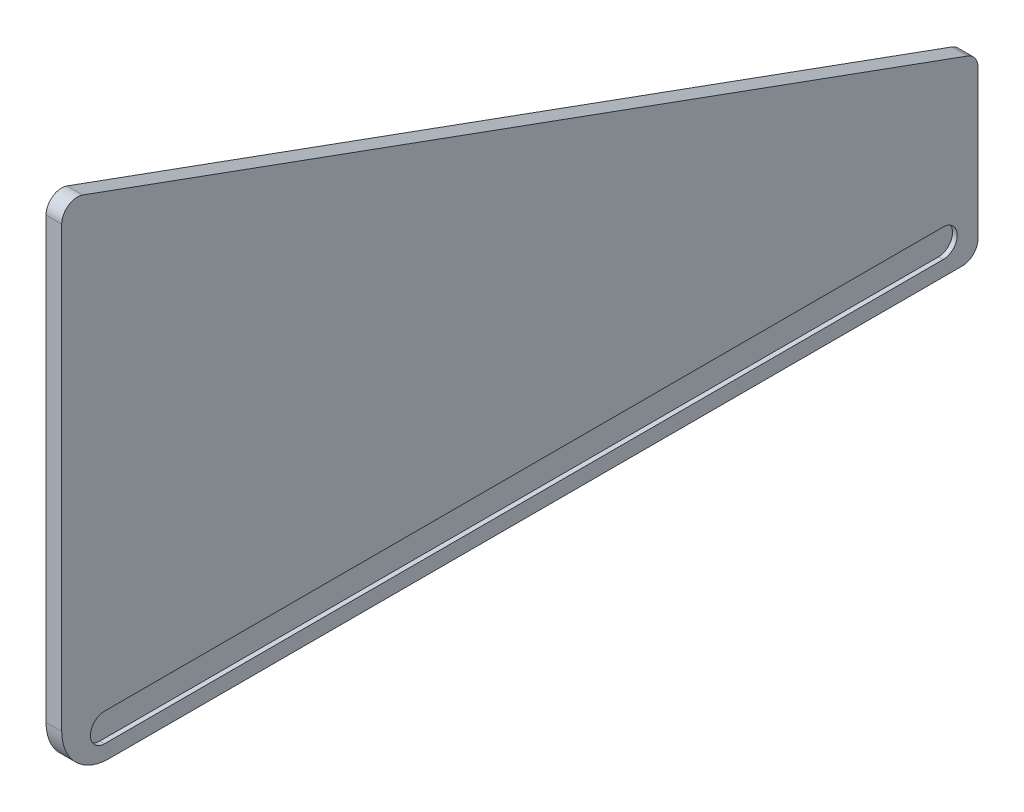
ISO-10303-21;
HEADER;
FILE_DESCRIPTION(('STEP AP214'),'2;1');
FILE_NAME('part.step','',(''),(''),'','','');
FILE_SCHEMA(('AUTOMOTIVE_DESIGN { 1 0 10303 214 1 1 1 1 }'));
ENDSEC;
DATA;
#1=APPLICATION_CONTEXT('core data for automotive mechanical design processes');
#2=APPLICATION_PROTOCOL_DEFINITION('international standard','automotive_design',2000,#1);
#3=PRODUCT_CONTEXT('',#1,'mechanical');
#4=PRODUCT('Part','Part','',(#3));
#5=PRODUCT_RELATED_PRODUCT_CATEGORY('part','',(#4));
#6=PRODUCT_DEFINITION_FORMATION('','',#4);
#7=PRODUCT_DEFINITION_CONTEXT('part definition',#1,'design');
#8=PRODUCT_DEFINITION('design','',#6,#7);
#9=PRODUCT_DEFINITION_SHAPE('','',#8);
#10=(LENGTH_UNIT() NAMED_UNIT(*) SI_UNIT(.MILLI.,.METRE.));
#11=(NAMED_UNIT(*) PLANE_ANGLE_UNIT() SI_UNIT($,.RADIAN.));
#12=(NAMED_UNIT(*) SI_UNIT($,.STERADIAN.) SOLID_ANGLE_UNIT());
#13=UNCERTAINTY_MEASURE_WITH_UNIT(LENGTH_MEASURE(1.E-05),#10,'distance_accuracy_value','');
#14=(GEOMETRIC_REPRESENTATION_CONTEXT(3) GLOBAL_UNCERTAINTY_ASSIGNED_CONTEXT((#13)) GLOBAL_UNIT_ASSIGNED_CONTEXT((#10,
#11,#12)) REPRESENTATION_CONTEXT('',''));
#15=CARTESIAN_POINT('',(0.,0.,0.));
#16=DIRECTION('',(0.,0.,1.));
#17=DIRECTION('',(1.,0.,0.));
#18=AXIS2_PLACEMENT_3D('',#15,#16,#17);
#19=CARTESIAN_POINT('',(10.,-294.281480067421,-30.));
#20=DIRECTION('',(-1.,0.,0.));
#21=DIRECTION('',(0.,0.,1.));
#22=AXIS2_PLACEMENT_3D('',#19,#20,#21);
#23=CYLINDRICAL_SURFACE('',#22,30.);
#24=CARTESIAN_POINT('',(0.,-294.281480067421,-30.));
#25=DIRECTION('',(1.,0.,0.));
#26=DIRECTION('',(0.,0.,1.));
#27=AXIS2_PLACEMENT_3D('',#24,#25,#26);
#28=CIRCLE('',#27,30.);
#29=CARTESIAN_POINT('',(0.,-294.281480067421,0.));
#30=VERTEX_POINT('',#29);
#31=CARTESIAN_POINT('',(0.,-324.281480067421,-30.));
#32=VERTEX_POINT('',#31);
#33=EDGE_CURVE('E285',#30,#32,#28,.T.);
#34=ORIENTED_EDGE('',*,*,#33,.T.);
#35=DIRECTION('',(-1.,0.,0.));
#36=VECTOR('',#35,1.);
#37=CARTESIAN_POINT('',(10.,-324.281480067421,-30.));
#38=LINE('',#37,#36);
#39=CARTESIAN_POINT('',(10.,-324.281480067421,-30.));
#40=VERTEX_POINT('',#39);
#41=EDGE_CURVE('E11',#40,#32,#38,.T.);
#42=ORIENTED_EDGE('',*,*,#41,.F.);
#43=CARTESIAN_POINT('',(10.,-294.281480067421,-30.));
#44=DIRECTION('',(1.,0.,0.));
#45=DIRECTION('',(0.,0.,1.));
#46=AXIS2_PLACEMENT_3D('',#43,#44,#45);
#47=CIRCLE('',#46,30.);
#48=CARTESIAN_POINT('',(10.,-294.281480067421,0.));
#49=VERTEX_POINT('',#48);
#50=EDGE_CURVE('E292',#49,#40,#47,.T.);
#51=ORIENTED_EDGE('',*,*,#50,.F.);
#52=DIRECTION('',(-1.,0.,0.));
#53=VECTOR('',#52,1.);
#54=CARTESIAN_POINT('',(10.,-294.281480067421,0.));
#55=LINE('',#54,#53);
#56=EDGE_CURVE('E310',#49,#30,#55,.T.);
#57=ORIENTED_EDGE('',*,*,#56,.T.);
#58=EDGE_LOOP('',(#34,#42,#51,#57));
#59=FACE_BOUND('',#58,.T.);
#60=ADVANCED_FACE('F34',(#59),#23,.T.);
#61=CARTESIAN_POINT('',(10.,-324.281480067421,-30.));
#62=DIRECTION('',(0.,1.,0.));
#63=DIRECTION('',(0.,0.,1.));
#64=AXIS2_PLACEMENT_3D('',#61,#62,#63);
#65=PLANE('',#64);
#66=DIRECTION('',(0.,0.,-1.));
#67=VECTOR('',#66,1.);
#68=CARTESIAN_POINT('',(0.,-324.281480067421,-30.));
#69=LINE('',#68,#67);
#70=CARTESIAN_POINT('',(0.,-324.281480067421,-573.815572471544));
#71=VERTEX_POINT('',#70);
#72=EDGE_CURVE('E313',#32,#71,#69,.T.);
#73=ORIENTED_EDGE('',*,*,#72,.T.);
#74=DIRECTION('',(-1.,0.,0.));
#75=VECTOR('',#74,1.);
#76=CARTESIAN_POINT('',(10.,-324.281480067421,-573.815572471544));
#77=LINE('',#76,#75);
#78=CARTESIAN_POINT('',(10.,-324.281480067421,-573.815572471544));
#79=VERTEX_POINT('',#78);
#80=EDGE_CURVE('E41',#79,#71,#77,.T.);
#81=ORIENTED_EDGE('',*,*,#80,.F.);
#82=DIRECTION('',(0.,0.,-1.));
#83=VECTOR('',#82,1.);
#84=CARTESIAN_POINT('',(10.,-324.281480067421,-30.));
#85=LINE('',#84,#83);
#86=EDGE_CURVE('E295',#40,#79,#85,.T.);
#87=ORIENTED_EDGE('',*,*,#86,.F.);
#88=ORIENTED_EDGE('',*,*,#41,.T.);
#89=EDGE_LOOP('',(#73,#81,#87,#88));
#90=FACE_BOUND('',#89,.T.);
#91=ADVANCED_FACE('F370',(#90),#65,.F.);
#92=CARTESIAN_POINT('',(10.,-314.281480067421,-573.815572471544));
#93=DIRECTION('',(-1.,0.,0.));
#94=DIRECTION('',(0.,0.,1.));
#95=AXIS2_PLACEMENT_3D('',#92,#93,#94);
#96=CYLINDRICAL_SURFACE('',#95,10.);
#97=CARTESIAN_POINT('',(0.,-314.281480067421,-573.815572471544));
#98=DIRECTION('',(1.,0.,0.));
#99=DIRECTION('',(0.,0.,-1.));
#100=AXIS2_PLACEMENT_3D('',#97,#98,#99);
#101=CIRCLE('',#100,10.);
#102=CARTESIAN_POINT('',(0.,-314.281480067421,-583.815572471544));
#103=VERTEX_POINT('',#102);
#104=EDGE_CURVE('E315',#71,#103,#101,.T.);
#105=ORIENTED_EDGE('',*,*,#104,.T.);
#106=DIRECTION('',(-1.,0.,0.));
#107=VECTOR('',#106,1.);
#108=CARTESIAN_POINT('',(10.,-314.281480067421,-583.815572471544));
#109=LINE('',#108,#107);
#110=CARTESIAN_POINT('',(10.,-314.281480067421,-583.815572471544));
#111=VERTEX_POINT('',#110);
#112=EDGE_CURVE('E340',#111,#103,#109,.T.);
#113=ORIENTED_EDGE('',*,*,#112,.F.);
#114=CARTESIAN_POINT('',(10.,-314.281480067421,-573.815572471544));
#115=DIRECTION('',(1.,0.,0.));
#116=DIRECTION('',(0.,0.,-1.));
#117=AXIS2_PLACEMENT_3D('',#114,#115,#116);
#118=CIRCLE('',#117,10.);
#119=EDGE_CURVE('E298',#79,#111,#118,.T.);
#120=ORIENTED_EDGE('',*,*,#119,.F.);
#121=ORIENTED_EDGE('',*,*,#80,.T.);
#122=EDGE_LOOP('',(#105,#113,#120,#121));
#123=FACE_BOUND('',#122,.T.);
#124=ADVANCED_FACE('F347',(#123),#96,.T.);
#125=CARTESIAN_POINT('',(10.,-314.281480067421,-583.815572471544));
#126=DIRECTION('',(0.,0.,1.));
#127=DIRECTION('',(1.,0.,0.));
#128=AXIS2_PLACEMENT_3D('',#125,#126,#127);
#129=PLANE('',#128);
#130=DIRECTION('',(0.,1.,0.));
#131=VECTOR('',#130,1.);
#132=CARTESIAN_POINT('',(0.,-314.281480067421,-583.815572471544));
#133=LINE('',#132,#131);
#134=CARTESIAN_POINT('',(0.,-219.493566062825,-583.815572471544));
#135=VERTEX_POINT('',#134);
#136=EDGE_CURVE('E317',#103,#135,#133,.T.);
#137=ORIENTED_EDGE('',*,*,#136,.T.);
#138=DIRECTION('',(-1.,0.,0.));
#139=VECTOR('',#138,1.);
#140=CARTESIAN_POINT('',(10.,-219.493566062825,-583.815572471544));
#141=LINE('',#140,#139);
#142=CARTESIAN_POINT('',(10.,-219.493566062825,-583.815572471544));
#143=VERTEX_POINT('',#142);
#144=EDGE_CURVE('E337',#143,#135,#141,.T.);
#145=ORIENTED_EDGE('',*,*,#144,.F.);
#146=DIRECTION('',(0.,1.,0.));
#147=VECTOR('',#146,1.);
#148=CARTESIAN_POINT('',(10.,-314.281480067421,-583.815572471544));
#149=LINE('',#148,#147);
#150=EDGE_CURVE('E300',#111,#143,#149,.T.);
#151=ORIENTED_EDGE('',*,*,#150,.F.);
#152=ORIENTED_EDGE('',*,*,#112,.T.);
#153=EDGE_LOOP('',(#137,#145,#151,#152));
#154=FACE_BOUND('',#153,.T.);
#155=ADVANCED_FACE('F358',(#154),#129,.F.);
#156=CARTESIAN_POINT('',(10.,-219.493566062825,-573.815572471544));
#157=DIRECTION('',(-1.,0.,0.));
#158=DIRECTION('',(0.,0.,1.));
#159=AXIS2_PLACEMENT_3D('',#156,#157,#158);
#160=CYLINDRICAL_SURFACE('',#159,10.);
#161=CARTESIAN_POINT('',(0.,-219.493566062825,-573.815572471544));
#162=DIRECTION('',(1.,0.,0.));
#163=DIRECTION('',(0.,0.,-1.));
#164=AXIS2_PLACEMENT_3D('',#161,#162,#163);
#165=CIRCLE('',#164,10.);
#166=CARTESIAN_POINT('',(0.,-210.096639854966,-577.235773904801));
#167=VERTEX_POINT('',#166);
#168=EDGE_CURVE('E319',#135,#167,#165,.T.);
#169=ORIENTED_EDGE('',*,*,#168,.T.);
#170=DIRECTION('',(-1.,0.,0.));
#171=VECTOR('',#170,1.);
#172=CARTESIAN_POINT('',(10.,-210.096639854966,-577.235773904801));
#173=LINE('',#172,#171);
#174=CARTESIAN_POINT('',(10.,-210.096639854966,-577.235773904801));
#175=VERTEX_POINT('',#174);
#176=EDGE_CURVE('E334',#175,#167,#173,.T.);
#177=ORIENTED_EDGE('',*,*,#176,.F.);
#178=CARTESIAN_POINT('',(10.,-219.493566062825,-573.815572471544));
#179=DIRECTION('',(1.,0.,0.));
#180=DIRECTION('',(0.,0.,-1.));
#181=AXIS2_PLACEMENT_3D('',#178,#179,#180);
#182=CIRCLE('',#181,10.);
#183=EDGE_CURVE('E302',#143,#175,#182,.T.);
#184=ORIENTED_EDGE('',*,*,#183,.F.);
#185=ORIENTED_EDGE('',*,*,#144,.T.);
#186=EDGE_LOOP('',(#169,#177,#184,#185));
#187=FACE_BOUND('',#186,.T.);
#188=ADVANCED_FACE('F362',(#187),#160,.T.);
#189=CARTESIAN_POINT('',(10.,-210.096639854966,-577.235773904801));
#190=DIRECTION('',(0.,-0.939692620785907,0.342020143325672));
#191=DIRECTION('',(0.,-0.342020143325672,-0.939692620785907));
#192=AXIS2_PLACEMENT_3D('',#189,#190,#191);
#193=PLANE('',#192);
#194=DIRECTION('',(0.,0.342020143325672,0.939692620785907));
#195=VECTOR('',#194,1.);
#196=CARTESIAN_POINT('',(0.,-210.096639854966,-577.235773904801));
#197=LINE('',#196,#195);
#198=CARTESIAN_POINT('',(0.,-4.88455385956217,-13.4202014332568));
#199=VERTEX_POINT('',#198);
#200=EDGE_CURVE('E321',#167,#199,#197,.T.);
#201=ORIENTED_EDGE('',*,*,#200,.T.);
#202=DIRECTION('',(-1.,0.,0.));
#203=VECTOR('',#202,1.);
#204=CARTESIAN_POINT('',(10.,-4.88455385956217,-13.4202014332568));
#205=LINE('',#204,#203);
#206=CARTESIAN_POINT('',(10.,-4.88455385956217,-13.4202014332568));
#207=VERTEX_POINT('',#206);
#208=EDGE_CURVE('E331',#207,#199,#205,.T.);
#209=ORIENTED_EDGE('',*,*,#208,.F.);
#210=DIRECTION('',(0.,0.342020143325672,0.939692620785907));
#211=VECTOR('',#210,1.);
#212=CARTESIAN_POINT('',(10.,-210.096639854966,-577.235773904801));
#213=LINE('',#212,#211);
#214=EDGE_CURVE('E304',#175,#207,#213,.T.);
#215=ORIENTED_EDGE('',*,*,#214,.F.);
#216=ORIENTED_EDGE('',*,*,#176,.T.);
#217=EDGE_LOOP('',(#201,#209,#215,#216));
#218=FACE_BOUND('',#217,.T.);
#219=ADVANCED_FACE('F383',(#218),#193,.F.);
#220=CARTESIAN_POINT('',(10.,-14.2814800674212,-10.));
#221=DIRECTION('',(-1.,0.,0.));
#222=DIRECTION('',(0.,0.,1.));
#223=AXIS2_PLACEMENT_3D('',#220,#221,#222);
#224=CYLINDRICAL_SURFACE('',#223,10.);
#225=CARTESIAN_POINT('',(0.,-14.2814800674212,-10.));
#226=DIRECTION('',(1.,0.,0.));
#227=DIRECTION('',(0.,0.,-1.));
#228=AXIS2_PLACEMENT_3D('',#225,#226,#227);
#229=CIRCLE('',#228,10.);
#230=CARTESIAN_POINT('',(0.,-14.2814800674213,0.));
#231=VERTEX_POINT('',#230);
#232=EDGE_CURVE('E323',#199,#231,#229,.T.);
#233=ORIENTED_EDGE('',*,*,#232,.T.);
#234=DIRECTION('',(-1.,0.,0.));
#235=VECTOR('',#234,1.);
#236=CARTESIAN_POINT('',(10.,-14.2814800674213,0.));
#237=LINE('',#236,#235);
#238=CARTESIAN_POINT('',(10.,-14.2814800674213,0.));
#239=VERTEX_POINT('',#238);
#240=EDGE_CURVE('E328',#239,#231,#237,.T.);
#241=ORIENTED_EDGE('',*,*,#240,.F.);
#242=CARTESIAN_POINT('',(10.,-14.2814800674212,-10.));
#243=DIRECTION('',(1.,0.,0.));
#244=DIRECTION('',(0.,0.,-1.));
#245=AXIS2_PLACEMENT_3D('',#242,#243,#244);
#246=CIRCLE('',#245,10.);
#247=EDGE_CURVE('E306',#207,#239,#246,.T.);
#248=ORIENTED_EDGE('',*,*,#247,.F.);
#249=ORIENTED_EDGE('',*,*,#208,.T.);
#250=EDGE_LOOP('',(#233,#241,#248,#249));
#251=FACE_BOUND('',#250,.T.);
#252=ADVANCED_FACE('F381',(#251),#224,.T.);
#253=CARTESIAN_POINT('',(10.,-14.2814800674213,0.));
#254=DIRECTION('',(0.,0.,-1.));
#255=DIRECTION('',(0.,1.,0.));
#256=AXIS2_PLACEMENT_3D('',#253,#254,#255);
#257=PLANE('',#256);
#258=DIRECTION('',(0.,-1.,0.));
#259=VECTOR('',#258,1.);
#260=CARTESIAN_POINT('',(0.,-14.2814800674213,0.));
#261=LINE('',#260,#259);
#262=EDGE_CURVE('E296',#231,#30,#261,.T.);
#263=ORIENTED_EDGE('',*,*,#262,.T.);
#264=ORIENTED_EDGE('',*,*,#56,.F.);
#265=DIRECTION('',(0.,-1.,0.));
#266=VECTOR('',#265,1.);
#267=CARTESIAN_POINT('',(10.,-14.2814800674213,0.));
#268=LINE('',#267,#266);
#269=EDGE_CURVE('E308',#239,#49,#268,.T.);
#270=ORIENTED_EDGE('',*,*,#269,.F.);
#271=ORIENTED_EDGE('',*,*,#240,.T.);
#272=EDGE_LOOP('',(#263,#264,#270,#271));
#273=FACE_BOUND('',#272,.T.);
#274=ADVANCED_FACE('F376',(#273),#257,.F.);
#275=CARTESIAN_POINT('',(10.,-294.281480067421,-30.));
#276=DIRECTION('',(-1.,0.,0.));
#277=DIRECTION('',(0.,0.,1.));
#278=AXIS2_PLACEMENT_3D('',#275,#276,#277);
#279=PLANE('',#278);
#280=DIRECTION('',(0.,0.,1.));
#281=VECTOR('',#280,1.);
#282=CARTESIAN_POINT('',(10.,-296.630106088856,-561.587294138042));
#283=LINE('',#282,#281);
#284=CARTESIAN_POINT('',(10.,-296.630106088856,-561.587294138042));
#285=VERTEX_POINT('',#284);
#286=CARTESIAN_POINT('',(10.,-296.630106088856,-27.2919792728029));
#287=VERTEX_POINT('',#286);
#288=EDGE_CURVE('E199',#285,#287,#283,.T.);
#289=ORIENTED_EDGE('',*,*,#288,.F.);
#290=CARTESIAN_POINT('',(10.,-305.630106088856,-561.587294138042));
#291=DIRECTION('',(1.,0.,0.));
#292=DIRECTION('',(0.,0.,-1.));
#293=AXIS2_PLACEMENT_3D('',#290,#291,#292);
#294=CIRCLE('',#293,9.00000000000001);
#295=CARTESIAN_POINT('',(10.,-314.630106088856,-561.587294138042));
#296=VERTEX_POINT('',#295);
#297=EDGE_CURVE('E48',#296,#285,#294,.T.);
#298=ORIENTED_EDGE('',*,*,#297,.F.);
#299=DIRECTION('',(0.,0.,-1.));
#300=VECTOR('',#299,1.);
#301=CARTESIAN_POINT('',(10.,-314.630106088856,-27.2919792728029));
#302=LINE('',#301,#300);
#303=CARTESIAN_POINT('',(10.,-314.630106088856,-27.2919792728029));
#304=VERTEX_POINT('',#303);
#305=EDGE_CURVE('E190',#304,#296,#302,.T.);
#306=ORIENTED_EDGE('',*,*,#305,.F.);
#307=CARTESIAN_POINT('',(10.,-305.630106088856,-27.2919792728029));
#308=DIRECTION('',(1.,0.,0.));
#309=DIRECTION('',(0.,0.,-1.));
#310=AXIS2_PLACEMENT_3D('',#307,#308,#309);
#311=CIRCLE('',#310,8.99999999999995);
#312=EDGE_CURVE('E193',#287,#304,#311,.T.);
#313=ORIENTED_EDGE('',*,*,#312,.F.);
#314=EDGE_LOOP('',(#289,#298,#306,#313));
#315=FACE_BOUND('',#314,.T.);
#316=ORIENTED_EDGE('',*,*,#50,.T.);
#317=ORIENTED_EDGE('',*,*,#86,.T.);
#318=ORIENTED_EDGE('',*,*,#119,.T.);
#319=ORIENTED_EDGE('',*,*,#150,.T.);
#320=ORIENTED_EDGE('',*,*,#183,.T.);
#321=ORIENTED_EDGE('',*,*,#214,.T.);
#322=ORIENTED_EDGE('',*,*,#247,.T.);
#323=ORIENTED_EDGE('',*,*,#269,.T.);
#324=EDGE_LOOP('',(#316,#317,#318,#319,#320,#321,#322,#323));
#325=FACE_BOUND('',#324,.T.);
#326=ADVANCED_FACE('F366',(#315,#325),#279,.F.);
#327=CARTESIAN_POINT('',(0.,-294.281480067421,-30.));
#328=DIRECTION('',(-1.,0.,0.));
#329=DIRECTION('',(0.,0.,1.));
#330=AXIS2_PLACEMENT_3D('',#327,#328,#329);
#331=PLANE('',#330);
#332=CARTESIAN_POINT('',(0.,-205.316311304833,-356.320107689534));
#333=CARTESIAN_POINT('',(0.,-205.964445920581,-352.838937222535));
#334=CARTESIAN_POINT('',(0.,-217.989087479131,-121.396454164475));
#335=CARTESIAN_POINT('',(0.,-66.6295550857602,-35.3127262433403));
#336=CARTESIAN_POINT('',(0.,-47.7372149956287,-26.9501856712703));
#337=B_SPLINE_CURVE_WITH_KNOTS('',3,(#332,#333,#334,#335,#336),.UNSPECIFIED.,.F.,.F.,(4,1,4),
(0.,0.409684669558369,1.),.UNSPECIFIED.);
#338=CARTESIAN_POINT('',(0.,-205.316311304832,-356.320107689534));
#339=VERTEX_POINT('',#338);
#340=CARTESIAN_POINT('',(0.,-47.7372149956287,-26.9501856712703));
#341=VERTEX_POINT('',#340);
#342=EDGE_CURVE('E56',#339,#341,#337,.T.);
#343=ORIENTED_EDGE('',*,*,#342,.F.);
#344=CARTESIAN_POINT('',(0.,-188.394419043439,-353.169539728973));
#345=DIRECTION('',(-1.,0.,0.));
#346=DIRECTION('',(0.,0.,1.));
#347=AXIS2_PLACEMENT_3D('',#344,#345,#346);
#348=CIRCLE('',#347,17.2126847464395);
#349=CARTESIAN_POINT('',(0.,-171.181734297002,-353.169530365349));
#350=VERTEX_POINT('',#349);
#351=EDGE_CURVE('E215',#350,#339,#348,.T.);
#352=ORIENTED_EDGE('',*,*,#351,.F.);
#353=CARTESIAN_POINT('',(0.,-39.1543533593346,-35.1249178966076));
#354=CARTESIAN_POINT('',(0.,-45.1224459351378,-50.6029528282735));
#355=CARTESIAN_POINT('',(0.,-170.661871262547,-99.0425390004754));
#356=CARTESIAN_POINT('',(0.,-171.181746235272,-331.224003862466));
#357=CARTESIAN_POINT('',(0.,-171.181734297002,-353.169530365349));
#358=B_SPLINE_CURVE_WITH_KNOTS('',3,(#353,#354,#355,#356,#357),.UNSPECIFIED.,.F.,.F.,(4,1,4),
(0.,0.639195597187541,1.),.UNSPECIFIED.);
#359=CARTESIAN_POINT('',(0.,-39.1543533593346,-35.1249178966076));
#360=VERTEX_POINT('',#359);
#361=EDGE_CURVE('E592',#360,#350,#358,.T.);
#362=ORIENTED_EDGE('',*,*,#361,.F.);
#363=CARTESIAN_POINT('',(0.,-45.1404123394199,-32.8167854808913));
#364=DIRECTION('',(-1.,0.,0.));
#365=DIRECTION('',(0.,0.,1.));
#366=AXIS2_PLACEMENT_3D('',#363,#364,#365);
#367=CIRCLE('',#366,6.41563538252756);
#368=EDGE_CURVE('E586',#341,#360,#367,.T.);
#369=ORIENTED_EDGE('',*,*,#368,.F.);
#370=EDGE_LOOP('',(#343,#352,#362,#369));
#371=FACE_BOUND('',#370,.T.);
#372=CARTESIAN_POINT('',(0.,-291.831036848789,-549.474047025916));
#373=CARTESIAN_POINT('',(0.,-306.502271197421,-474.750080898962));
#374=CARTESIAN_POINT('',(0.,-324.572171749127,-284.669923622883));
#375=CARTESIAN_POINT('',(0.,-266.034178467192,-143.080818041075));
#376=CARTESIAN_POINT('',(0.,-218.017297736922,-23.1621757846725));
#377=B_SPLINE_CURVE_WITH_KNOTS('',3,(#372,#373,#374,#375,#376),.UNSPECIFIED.,.F.,.F.,(4,1,4),
(0.,0.423888314021505,1.),.UNSPECIFIED.);
#378=CARTESIAN_POINT('',(0.,-291.831036848789,-549.474047025916));
#379=VERTEX_POINT('',#378);
#380=CARTESIAN_POINT('',(0.,-218.017297736922,-23.1621757846725));
#381=VERTEX_POINT('',#380);
#382=EDGE_CURVE('E260',#379,#381,#377,.T.);
#383=ORIENTED_EDGE('',*,*,#382,.F.);
#384=CARTESIAN_POINT('',(0.,-274.942255754465,-546.15811937726));
#385=DIRECTION('',(-1.,0.,0.));
#386=DIRECTION('',(0.,0.,1.));
#387=AXIS2_PLACEMENT_3D('',#384,#385,#386);
#388=CIRCLE('',#387,17.2112260755334);
#389=CARTESIAN_POINT('',(0.,-257.731029978854,-546.154906268973));
#390=VERTEX_POINT('',#389);
#391=EDGE_CURVE('E276',#390,#379,#388,.T.);
#392=ORIENTED_EDGE('',*,*,#391,.F.);
#393=CARTESIAN_POINT('',(0.,-200.318314743193,-26.7381200613058));
#394=CARTESIAN_POINT('',(0.,-200.660753586686,-45.9143544336099));
#395=CARTESIAN_POINT('',(0.,-255.510398156368,-151.321073340182));
#396=CARTESIAN_POINT('',(0.,-286.385074175091,-414.880335600918));
#397=CARTESIAN_POINT('',(0.,-257.731725159021,-542.431128001592));
#398=CARTESIAN_POINT('',(0.,-257.731029978854,-546.154906268973));
#399=B_SPLINE_CURVE_WITH_KNOTS('',3,(#393,#394,#395,#396,#397,#398),.UNSPECIFIED.,.F.,.F.,(4,1,
1,4),(0.,0.560935224009475,0.660935224009475,1.),.UNSPECIFIED.);
#400=CARTESIAN_POINT('',(0.,-200.318314743193,-26.7381200613058));
#401=VERTEX_POINT('',#400);
#402=EDGE_CURVE('E271',#401,#390,#399,.T.);
#403=ORIENTED_EDGE('',*,*,#402,.F.);
#404=CARTESIAN_POINT('',(0.,-209.495939813425,-26.5742309862116));
#405=DIRECTION('',(-1.,0.,0.));
#406=DIRECTION('',(0.,0.,1.));
#407=AXIS2_PLACEMENT_3D('',#404,#405,#406);
#408=CIRCLE('',#407,9.17908827491534);
#409=EDGE_CURVE('E264',#381,#401,#408,.T.);
#410=ORIENTED_EDGE('',*,*,#409,.F.);
#411=EDGE_LOOP('',(#383,#392,#403,#410));
#412=FACE_BOUND('',#411,.T.);
#413=ORIENTED_EDGE('',*,*,#33,.F.);
#414=ORIENTED_EDGE('',*,*,#262,.F.);
#415=ORIENTED_EDGE('',*,*,#232,.F.);
#416=ORIENTED_EDGE('',*,*,#200,.F.);
#417=ORIENTED_EDGE('',*,*,#168,.F.);
#418=ORIENTED_EDGE('',*,*,#136,.F.);
#419=ORIENTED_EDGE('',*,*,#104,.F.);
#420=ORIENTED_EDGE('',*,*,#72,.F.);
#421=EDGE_LOOP('',(#413,#414,#415,#416,#417,#418,#419,#420));
#422=FACE_BOUND('',#421,.T.);
#423=ADVANCED_FACE('F353',(#371,#412,#422),#331,.T.);
#424=CARTESIAN_POINT('',(3.,-291.831036848789,-549.474047025916));
#425=CARTESIAN_POINT('',(3.,-306.502271197421,-474.750080898962));
#426=CARTESIAN_POINT('',(3.,-324.572171749127,-284.669923622883));
#427=CARTESIAN_POINT('',(3.,-266.034178467192,-143.080818041075));
#428=CARTESIAN_POINT('',(3.,-218.017297736922,-23.1621757846725));
#429=B_SPLINE_CURVE_WITH_KNOTS('',3,(#424,#425,#426,#427,#428),.UNSPECIFIED.,.F.,.F.,(4,1,4),
(0.,0.423888314021505,1.),.UNSPECIFIED.);
#430=DIRECTION('',(-1.,0.,0.));
#431=VECTOR('',#430,1.);
#432=SURFACE_OF_LINEAR_EXTRUSION('',#429,#431);
#433=ORIENTED_EDGE('',*,*,#382,.T.);
#434=DIRECTION('',(-1.,0.,0.));
#435=VECTOR('',#434,1.);
#436=CARTESIAN_POINT('',(3.,-218.017297736922,-23.1621757846725));
#437=LINE('',#436,#435);
#438=CARTESIAN_POINT('',(3.,-218.017297736922,-23.1621757846725));
#439=VERTEX_POINT('',#438);
#440=EDGE_CURVE('E259',#439,#381,#437,.T.);
#441=ORIENTED_EDGE('',*,*,#440,.F.);
#442=CARTESIAN_POINT('',(3.,-291.831036848789,-549.474047025916));
#443=VERTEX_POINT('',#442);
#444=EDGE_CURVE('E282',#443,#439,#429,.T.);
#445=ORIENTED_EDGE('',*,*,#444,.F.);
#446=DIRECTION('',(-1.,0.,0.));
#447=VECTOR('',#446,1.);
#448=CARTESIAN_POINT('',(3.,-291.831036848789,-549.474047025916));
#449=LINE('',#448,#447);
#450=EDGE_CURVE('E283',#443,#379,#449,.T.);
#451=ORIENTED_EDGE('',*,*,#450,.T.);
#452=EDGE_LOOP('',(#433,#441,#445,#451));
#453=FACE_BOUND('',#452,.T.);
#454=ADVANCED_FACE('F237',(#453),#432,.F.);
#455=CARTESIAN_POINT('',(3.,-274.942255754465,-546.15811937726));
#456=DIRECTION('',(-1.,0.,0.));
#457=DIRECTION('',(0.,0.,1.));
#458=AXIS2_PLACEMENT_3D('',#455,#456,#457);
#459=CYLINDRICAL_SURFACE('',#458,17.2112260755334);
#460=ORIENTED_EDGE('',*,*,#391,.T.);
#461=ORIENTED_EDGE('',*,*,#450,.F.);
#462=CARTESIAN_POINT('',(3.,-274.942255754465,-546.15811937726));
#463=DIRECTION('',(-1.,0.,0.));
#464=DIRECTION('',(0.,0.,1.));
#465=AXIS2_PLACEMENT_3D('',#462,#463,#464);
#466=CIRCLE('',#465,17.2112260755334);
#467=CARTESIAN_POINT('',(3.,-257.731029978854,-546.154906268973));
#468=VERTEX_POINT('',#467);
#469=EDGE_CURVE('E251',#468,#443,#466,.T.);
#470=ORIENTED_EDGE('',*,*,#469,.F.);
#471=DIRECTION('',(-1.,0.,0.));
#472=VECTOR('',#471,1.);
#473=CARTESIAN_POINT('',(3.,-257.731029978854,-546.154906268973));
#474=LINE('',#473,#472);
#475=EDGE_CURVE('E286',#468,#390,#474,.T.);
#476=ORIENTED_EDGE('',*,*,#475,.T.);
#477=EDGE_LOOP('',(#460,#461,#470,#476));
#478=FACE_BOUND('',#477,.T.);
#479=ADVANCED_FACE('F233',(#478),#459,.F.);
#480=CARTESIAN_POINT('',(3.,-200.318314743193,-26.7381200613058));
#481=CARTESIAN_POINT('',(3.,-200.660753586686,-45.9143544336099));
#482=CARTESIAN_POINT('',(3.,-255.510398156368,-151.321073340182));
#483=CARTESIAN_POINT('',(3.,-286.385074175091,-414.880335600918));
#484=CARTESIAN_POINT('',(3.,-257.731725159021,-542.431128001592));
#485=CARTESIAN_POINT('',(3.,-257.731029978854,-546.154906268973));
#486=B_SPLINE_CURVE_WITH_KNOTS('',3,(#480,#481,#482,#483,#484,#485),.UNSPECIFIED.,.F.,.F.,(4,1,
1,4),(0.,0.560935224009475,0.660935224009475,1.),.UNSPECIFIED.);
#487=DIRECTION('',(-1.,0.,0.));
#488=VECTOR('',#487,1.);
#489=SURFACE_OF_LINEAR_EXTRUSION('',#486,#488);
#490=ORIENTED_EDGE('',*,*,#402,.T.);
#491=ORIENTED_EDGE('',*,*,#475,.F.);
#492=CARTESIAN_POINT('',(3.,-200.318314743193,-26.7381200613058));
#493=VERTEX_POINT('',#492);
#494=EDGE_CURVE('E244',#493,#468,#486,.T.);
#495=ORIENTED_EDGE('',*,*,#494,.F.);
#496=DIRECTION('',(-1.,0.,0.));
#497=VECTOR('',#496,1.);
#498=CARTESIAN_POINT('',(3.,-200.318314743193,-26.7381200613058));
#499=LINE('',#498,#497);
#500=EDGE_CURVE('E288',#493,#401,#499,.T.);
#501=ORIENTED_EDGE('',*,*,#500,.T.);
#502=EDGE_LOOP('',(#490,#491,#495,#501));
#503=FACE_BOUND('',#502,.T.);
#504=ADVANCED_FACE('F236',(#503),#489,.F.);
#505=CARTESIAN_POINT('',(3.,-209.495939813425,-26.5742309862116));
#506=DIRECTION('',(-1.,0.,0.));
#507=DIRECTION('',(0.,0.,1.));
#508=AXIS2_PLACEMENT_3D('',#505,#506,#507);
#509=CYLINDRICAL_SURFACE('',#508,9.17908827491534);
#510=ORIENTED_EDGE('',*,*,#409,.T.);
#511=ORIENTED_EDGE('',*,*,#500,.F.);
#512=CARTESIAN_POINT('',(3.,-209.495939813425,-26.5742309862116));
#513=DIRECTION('',(-1.,0.,0.));
#514=DIRECTION('',(0.,0.,1.));
#515=AXIS2_PLACEMENT_3D('',#512,#513,#514);
#516=CIRCLE('',#515,9.17908827491534);
#517=EDGE_CURVE('E252',#439,#493,#516,.T.);
#518=ORIENTED_EDGE('',*,*,#517,.F.);
#519=ORIENTED_EDGE('',*,*,#440,.T.);
#520=EDGE_LOOP('',(#510,#511,#518,#519));
#521=FACE_BOUND('',#520,.T.);
#522=ADVANCED_FACE('F231',(#521),#509,.F.);
#523=CARTESIAN_POINT('',(3.,-303.462035884563,-284.326105547402));
#524=DIRECTION('',(1.,0.,0.));
#525=DIRECTION('',(0.,0.,-1.));
#526=AXIS2_PLACEMENT_3D('',#523,#524,#525);
#527=PLANE('',#526);
#528=ORIENTED_EDGE('',*,*,#444,.T.);
#529=ORIENTED_EDGE('',*,*,#517,.T.);
#530=ORIENTED_EDGE('',*,*,#494,.T.);
#531=ORIENTED_EDGE('',*,*,#469,.T.);
#532=EDGE_LOOP('',(#528,#529,#530,#531));
#533=FACE_BOUND('',#532,.T.);
#534=ADVANCED_FACE('F226',(#533),#527,.F.);
#535=CARTESIAN_POINT('',(3.,-205.316311304833,-356.320107689534));
#536=CARTESIAN_POINT('',(3.,-205.964445920581,-352.838937222535));
#537=CARTESIAN_POINT('',(3.,-217.989087479131,-121.396454164475));
#538=CARTESIAN_POINT('',(3.,-66.6295550857602,-35.3127262433403));
#539=CARTESIAN_POINT('',(3.,-47.7372149956287,-26.9501856712703));
#540=B_SPLINE_CURVE_WITH_KNOTS('',3,(#535,#536,#537,#538,#539),.UNSPECIFIED.,.F.,.F.,(4,1,4),
(0.,0.409684669558369,1.),.UNSPECIFIED.);
#541=DIRECTION('',(-1.,0.,0.));
#542=VECTOR('',#541,1.);
#543=SURFACE_OF_LINEAR_EXTRUSION('',#540,#542);
#544=ORIENTED_EDGE('',*,*,#342,.T.);
#545=DIRECTION('',(-1.,0.,0.));
#546=VECTOR('',#545,1.);
#547=CARTESIAN_POINT('',(3.,-47.7372149956287,-26.9501856712703));
#548=LINE('',#547,#546);
#549=CARTESIAN_POINT('',(3.,-47.7372149956287,-26.9501856712703));
#550=VERTEX_POINT('',#549);
#551=EDGE_CURVE('E582',#550,#341,#548,.T.);
#552=ORIENTED_EDGE('',*,*,#551,.F.);
#553=CARTESIAN_POINT('',(3.,-205.316311304832,-356.320107689534));
#554=VERTEX_POINT('',#553);
#555=EDGE_CURVE('E208',#554,#550,#540,.T.);
#556=ORIENTED_EDGE('',*,*,#555,.F.);
#557=DIRECTION('',(-1.,0.,0.));
#558=VECTOR('',#557,1.);
#559=CARTESIAN_POINT('',(3.,-205.316311304832,-356.320107689534));
#560=LINE('',#559,#558);
#561=EDGE_CURVE('E265',#554,#339,#560,.T.);
#562=ORIENTED_EDGE('',*,*,#561,.T.);
#563=EDGE_LOOP('',(#544,#552,#556,#562));
#564=FACE_BOUND('',#563,.T.);
#565=ADVANCED_FACE('F221',(#564),#543,.F.);
#566=CARTESIAN_POINT('',(3.,-188.394419043439,-353.169539728973));
#567=DIRECTION('',(-1.,0.,0.));
#568=DIRECTION('',(0.,0.,1.));
#569=AXIS2_PLACEMENT_3D('',#566,#567,#568);
#570=CYLINDRICAL_SURFACE('',#569,17.2126847464395);
#571=ORIENTED_EDGE('',*,*,#351,.T.);
#572=ORIENTED_EDGE('',*,*,#561,.F.);
#573=CARTESIAN_POINT('',(3.,-188.394419043439,-353.169539728973));
#574=DIRECTION('',(-1.,0.,0.));
#575=DIRECTION('',(0.,0.,1.));
#576=AXIS2_PLACEMENT_3D('',#573,#574,#575);
#577=CIRCLE('',#576,17.2126847464395);
#578=CARTESIAN_POINT('',(3.,-171.181734297002,-353.169530365349));
#579=VERTEX_POINT('',#578);
#580=EDGE_CURVE('E576',#579,#554,#577,.T.);
#581=ORIENTED_EDGE('',*,*,#580,.F.);
#582=DIRECTION('',(-1.,0.,0.));
#583=VECTOR('',#582,1.);
#584=CARTESIAN_POINT('',(3.,-171.181734297002,-353.169530365349));
#585=LINE('',#584,#583);
#586=EDGE_CURVE('E603',#579,#350,#585,.T.);
#587=ORIENTED_EDGE('',*,*,#586,.T.);
#588=EDGE_LOOP('',(#571,#572,#581,#587));
#589=FACE_BOUND('',#588,.T.);
#590=ADVANCED_FACE('F225',(#589),#570,.F.);
#591=CARTESIAN_POINT('',(3.,-39.1543533593346,-35.1249178966076));
#592=CARTESIAN_POINT('',(3.,-45.1224459351378,-50.6029528282735));
#593=CARTESIAN_POINT('',(3.,-170.661871262547,-99.0425390004754));
#594=CARTESIAN_POINT('',(3.,-171.181746235272,-331.224003862466));
#595=CARTESIAN_POINT('',(3.,-171.181734297002,-353.169530365349));
#596=B_SPLINE_CURVE_WITH_KNOTS('',3,(#591,#592,#593,#594,#595),.UNSPECIFIED.,.F.,.F.,(4,1,4),
(0.,0.639195597187541,1.),.UNSPECIFIED.);
#597=DIRECTION('',(-1.,0.,0.));
#598=VECTOR('',#597,1.);
#599=SURFACE_OF_LINEAR_EXTRUSION('',#596,#598);
#600=ORIENTED_EDGE('',*,*,#361,.T.);
#601=ORIENTED_EDGE('',*,*,#586,.F.);
#602=CARTESIAN_POINT('',(3.,-39.1543533593346,-35.1249178966076));
#603=VERTEX_POINT('',#602);
#604=EDGE_CURVE('E570',#603,#579,#596,.T.);
#605=ORIENTED_EDGE('',*,*,#604,.F.);
#606=DIRECTION('',(-1.,0.,0.));
#607=VECTOR('',#606,1.);
#608=CARTESIAN_POINT('',(3.,-39.1543533593346,-35.1249178966076));
#609=LINE('',#608,#607);
#610=EDGE_CURVE('E605',#603,#360,#609,.T.);
#611=ORIENTED_EDGE('',*,*,#610,.T.);
#612=EDGE_LOOP('',(#600,#601,#605,#611));
#613=FACE_BOUND('',#612,.T.);
#614=ADVANCED_FACE('F488',(#613),#599,.F.);
#615=CARTESIAN_POINT('',(3.,-45.1404123394199,-32.8167854808913));
#616=DIRECTION('',(-1.,0.,0.));
#617=DIRECTION('',(0.,0.,1.));
#618=AXIS2_PLACEMENT_3D('',#615,#616,#617);
#619=CYLINDRICAL_SURFACE('',#618,6.41563538252756);
#620=ORIENTED_EDGE('',*,*,#368,.T.);
#621=ORIENTED_EDGE('',*,*,#610,.F.);
#622=CARTESIAN_POINT('',(3.,-45.1404123394199,-32.8167854808913));
#623=DIRECTION('',(-1.,0.,0.));
#624=DIRECTION('',(0.,0.,1.));
#625=AXIS2_PLACEMENT_3D('',#622,#623,#624);
#626=CIRCLE('',#625,6.41563538252756);
#627=EDGE_CURVE('E214',#550,#603,#626,.T.);
#628=ORIENTED_EDGE('',*,*,#627,.F.);
#629=ORIENTED_EDGE('',*,*,#551,.T.);
#630=EDGE_LOOP('',(#620,#621,#628,#629));
#631=FACE_BOUND('',#630,.T.);
#632=ADVANCED_FACE('F227',(#631),#619,.F.);
#633=CARTESIAN_POINT('',(3.,-169.974525325643,-144.553707246625));
#634=DIRECTION('',(1.,0.,0.));
#635=DIRECTION('',(0.,0.,-1.));
#636=AXIS2_PLACEMENT_3D('',#633,#634,#635);
#637=PLANE('',#636);
#638=ORIENTED_EDGE('',*,*,#555,.T.);
#639=ORIENTED_EDGE('',*,*,#627,.T.);
#640=ORIENTED_EDGE('',*,*,#604,.T.);
#641=ORIENTED_EDGE('',*,*,#580,.T.);
#642=EDGE_LOOP('',(#638,#639,#640,#641));
#643=FACE_BOUND('',#642,.T.);
#644=ADVANCED_FACE('F506',(#643),#637,.F.);
#645=CARTESIAN_POINT('',(7.,-305.630106088856,-561.587294138042));
#646=DIRECTION('',(1.,0.,0.));
#647=DIRECTION('',(0.,0.,-1.));
#648=AXIS2_PLACEMENT_3D('',#645,#646,#647);
#649=CYLINDRICAL_SURFACE('',#648,9.00000000000001);
#650=ORIENTED_EDGE('',*,*,#297,.T.);
#651=DIRECTION('',(1.,0.,0.));
#652=VECTOR('',#651,1.);
#653=CARTESIAN_POINT('',(7.,-296.630106088856,-561.587294138042));
#654=LINE('',#653,#652);
#655=CARTESIAN_POINT('',(7.,-296.630106088856,-561.587294138042));
#656=VERTEX_POINT('',#655);
#657=EDGE_CURVE('E168',#656,#285,#654,.T.);
#658=ORIENTED_EDGE('',*,*,#657,.F.);
#659=CARTESIAN_POINT('',(7.,-305.630106088856,-561.587294138042));
#660=DIRECTION('',(1.,0.,0.));
#661=DIRECTION('',(0.,0.,-1.));
#662=AXIS2_PLACEMENT_3D('',#659,#660,#661);
#663=CIRCLE('',#662,9.00000000000001);
#664=CARTESIAN_POINT('',(7.,-314.630106088856,-561.587294138042));
#665=VERTEX_POINT('',#664);
#666=EDGE_CURVE('E172',#665,#656,#663,.T.);
#667=ORIENTED_EDGE('',*,*,#666,.F.);
#668=DIRECTION('',(1.,0.,0.));
#669=VECTOR('',#668,1.);
#670=CARTESIAN_POINT('',(7.,-314.630106088856,-561.587294138042));
#671=LINE('',#670,#669);
#672=EDGE_CURVE('E203',#665,#296,#671,.T.);
#673=ORIENTED_EDGE('',*,*,#672,.T.);
#674=EDGE_LOOP('',(#650,#658,#667,#673));
#675=FACE_BOUND('',#674,.T.);
#676=ADVANCED_FACE('F170',(#675),#649,.F.);
#677=CARTESIAN_POINT('',(7.,-314.630106088856,-27.2919792728029));
#678=DIRECTION('',(0.,-1.,0.));
#679=DIRECTION('',(0.,0.,-1.));
#680=AXIS2_PLACEMENT_3D('',#677,#678,#679);
#681=PLANE('',#680);
#682=ORIENTED_EDGE('',*,*,#305,.T.);
#683=ORIENTED_EDGE('',*,*,#672,.F.);
#684=DIRECTION('',(0.,0.,-1.));
#685=VECTOR('',#684,1.);
#686=CARTESIAN_POINT('',(7.,-314.630106088856,-27.2919792728029));
#687=LINE('',#686,#685);
#688=CARTESIAN_POINT('',(7.,-314.630106088856,-27.2919792728029));
#689=VERTEX_POINT('',#688);
#690=EDGE_CURVE('E178',#689,#665,#687,.T.);
#691=ORIENTED_EDGE('',*,*,#690,.F.);
#692=DIRECTION('',(1.,0.,0.));
#693=VECTOR('',#692,1.);
#694=CARTESIAN_POINT('',(7.,-314.630106088856,-27.2919792728029));
#695=LINE('',#694,#693);
#696=EDGE_CURVE('E205',#689,#304,#695,.T.);
#697=ORIENTED_EDGE('',*,*,#696,.T.);
#698=EDGE_LOOP('',(#682,#683,#691,#697));
#699=FACE_BOUND('',#698,.T.);
#700=ADVANCED_FACE('F531',(#699),#681,.F.);
#701=CARTESIAN_POINT('',(7.,-305.630106088856,-27.2919792728029));
#702=DIRECTION('',(1.,0.,0.));
#703=DIRECTION('',(0.,0.,-1.));
#704=AXIS2_PLACEMENT_3D('',#701,#702,#703);
#705=CYLINDRICAL_SURFACE('',#704,8.99999999999995);
#706=ORIENTED_EDGE('',*,*,#312,.T.);
#707=ORIENTED_EDGE('',*,*,#696,.F.);
#708=CARTESIAN_POINT('',(7.,-305.630106088856,-27.2919792728029));
#709=DIRECTION('',(1.,0.,0.));
#710=DIRECTION('',(0.,0.,-1.));
#711=AXIS2_PLACEMENT_3D('',#708,#709,#710);
#712=CIRCLE('',#711,8.99999999999995);
#713=CARTESIAN_POINT('',(7.,-296.630106088856,-27.2919792728029));
#714=VERTEX_POINT('',#713);
#715=EDGE_CURVE('E186',#714,#689,#712,.T.);
#716=ORIENTED_EDGE('',*,*,#715,.F.);
#717=DIRECTION('',(1.,0.,0.));
#718=VECTOR('',#717,1.);
#719=CARTESIAN_POINT('',(7.,-296.630106088856,-27.2919792728029));
#720=LINE('',#719,#718);
#721=EDGE_CURVE('E177',#714,#287,#720,.T.);
#722=ORIENTED_EDGE('',*,*,#721,.T.);
#723=EDGE_LOOP('',(#706,#707,#716,#722));
#724=FACE_BOUND('',#723,.T.);
#725=ADVANCED_FACE('F540',(#724),#705,.F.);
#726=CARTESIAN_POINT('',(7.,-296.630106088856,-561.587294138042));
#727=DIRECTION('',(0.,1.,0.));
#728=DIRECTION('',(0.,0.,1.));
#729=AXIS2_PLACEMENT_3D('',#726,#727,#728);
#730=PLANE('',#729);
#731=ORIENTED_EDGE('',*,*,#288,.T.);
#732=ORIENTED_EDGE('',*,*,#721,.F.);
#733=DIRECTION('',(0.,0.,1.));
#734=VECTOR('',#733,1.);
#735=CARTESIAN_POINT('',(7.,-296.630106088856,-561.587294138042));
#736=LINE('',#735,#734);
#737=EDGE_CURVE('E181',#656,#714,#736,.T.);
#738=ORIENTED_EDGE('',*,*,#737,.F.);
#739=ORIENTED_EDGE('',*,*,#657,.T.);
#740=EDGE_LOOP('',(#731,#732,#738,#739));
#741=FACE_BOUND('',#740,.T.);
#742=ADVANCED_FACE('F182',(#741),#730,.F.);
#743=CARTESIAN_POINT('',(7.,-305.630106088856,-561.587294138042));
#744=DIRECTION('',(1.,0.,0.));
#745=DIRECTION('',(0.,0.,-1.));
#746=AXIS2_PLACEMENT_3D('',#743,#744,#745);
#747=PLANE('',#746);
#748=ORIENTED_EDGE('',*,*,#666,.T.);
#749=ORIENTED_EDGE('',*,*,#737,.T.);
#750=ORIENTED_EDGE('',*,*,#715,.T.);
#751=ORIENTED_EDGE('',*,*,#690,.T.);
#752=EDGE_LOOP('',(#748,#749,#750,#751));
#753=FACE_BOUND('',#752,.T.);
#754=ADVANCED_FACE('F188',(#753),#747,.T.);
#755=CLOSED_SHELL('',(#60,#91,#124,#155,#188,#219,#252,#274,#326,#423,#454,#479,#504,#522,#534,
#565,#590,#614,#632,#644,#676,#700,#725,#742,#754));
#756=MANIFOLD_SOLID_BREP('B2',#755);
#757=ADVANCED_BREP_SHAPE_REPRESENTATION('',(#18,#756),#14);
#758=SHAPE_DEFINITION_REPRESENTATION(#9,#757);
ENDSEC;
END-ISO-10303-21;
